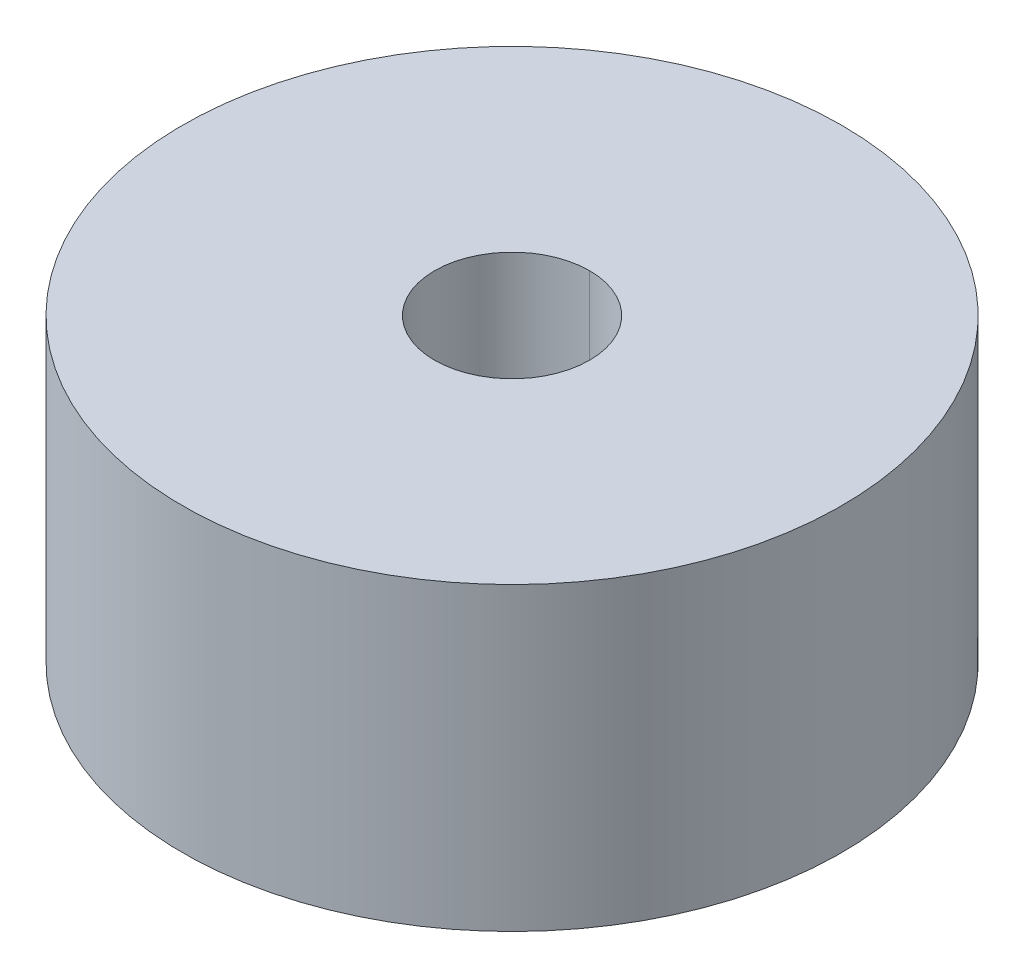
ISO-10303-21;
HEADER;
FILE_DESCRIPTION(('STEP AP214'),'2;1');
FILE_NAME('part.step','',(''),(''),'','','');
FILE_SCHEMA(('AUTOMOTIVE_DESIGN { 1 0 10303 214 1 1 1 1 }'));
ENDSEC;
DATA;
#1=APPLICATION_CONTEXT('core data for automotive mechanical design processes');
#2=APPLICATION_PROTOCOL_DEFINITION('international standard','automotive_design',2000,#1);
#3=PRODUCT_CONTEXT('',#1,'mechanical');
#4=PRODUCT('Part','Part','',(#3));
#5=PRODUCT_RELATED_PRODUCT_CATEGORY('part','',(#4));
#6=PRODUCT_DEFINITION_FORMATION('','',#4);
#7=PRODUCT_DEFINITION_CONTEXT('part definition',#1,'design');
#8=PRODUCT_DEFINITION('design','',#6,#7);
#9=PRODUCT_DEFINITION_SHAPE('','',#8);
#10=(LENGTH_UNIT() NAMED_UNIT(*) SI_UNIT(.MILLI.,.METRE.));
#11=(NAMED_UNIT(*) PLANE_ANGLE_UNIT() SI_UNIT($,.RADIAN.));
#12=(NAMED_UNIT(*) SI_UNIT($,.STERADIAN.) SOLID_ANGLE_UNIT());
#13=UNCERTAINTY_MEASURE_WITH_UNIT(LENGTH_MEASURE(1.E-05),#10,'distance_accuracy_value','');
#14=(GEOMETRIC_REPRESENTATION_CONTEXT(3) GLOBAL_UNCERTAINTY_ASSIGNED_CONTEXT((#13)) GLOBAL_UNIT_ASSIGNED_CONTEXT((#10,
#11,#12)) REPRESENTATION_CONTEXT('',''));
#15=CARTESIAN_POINT('',(0.,0.,0.));
#16=DIRECTION('',(0.,0.,1.));
#17=DIRECTION('',(1.,0.,0.));
#18=AXIS2_PLACEMENT_3D('',#15,#16,#17);
#19=CARTESIAN_POINT('',(0.,0.,14.));
#20=DIRECTION('',(0.,-1.,0.));
#21=DIRECTION('',(0.,0.,-1.));
#22=AXIS2_PLACEMENT_3D('',#19,#20,#21);
#23=CYLINDRICAL_SURFACE('',#22,2.1);
#24=DIRECTION('',(0.,-1.,0.));
#25=VECTOR('',#24,1.);
#26=CARTESIAN_POINT('',(0.,0.,16.1));
#27=LINE('',#26,#25);
#28=CARTESIAN_POINT('',(0.,5.,16.1));
#29=VERTEX_POINT('',#28);
#30=CARTESIAN_POINT('',(0.,0.,16.1));
#31=VERTEX_POINT('',#30);
#32=EDGE_CURVE('E249',#29,#31,#27,.T.);
#33=ORIENTED_EDGE('',*,*,#32,.F.);
#34=CARTESIAN_POINT('',(0.,5.,14.));
#35=DIRECTION('',(0.,-1.,0.));
#36=DIRECTION('',(0.,0.,-1.));
#37=AXIS2_PLACEMENT_3D('',#34,#35,#36);
#38=CIRCLE('',#37,2.1);
#39=CARTESIAN_POINT('',(0.,5.,11.9));
#40=VERTEX_POINT('',#39);
#41=EDGE_CURVE('E11',#40,#29,#38,.T.);
#42=ORIENTED_EDGE('',*,*,#41,.F.);
#43=DIRECTION('',(0.,-1.,0.));
#44=VECTOR('',#43,1.);
#45=CARTESIAN_POINT('',(0.,0.,11.9));
#46=LINE('',#45,#44);
#47=CARTESIAN_POINT('',(0.,0.,11.9));
#48=VERTEX_POINT('',#47);
#49=EDGE_CURVE('E333',#40,#48,#46,.T.);
#50=ORIENTED_EDGE('',*,*,#49,.T.);
#51=CARTESIAN_POINT('',(0.,0.,14.));
#52=DIRECTION('',(0.,-1.,0.));
#53=DIRECTION('',(0.,0.,-1.));
#54=AXIS2_PLACEMENT_3D('',#51,#52,#53);
#55=CIRCLE('',#54,2.1);
#56=EDGE_CURVE('E325',#48,#31,#55,.T.);
#57=ORIENTED_EDGE('',*,*,#56,.T.);
#58=EDGE_LOOP('',(#33,#42,#50,#57));
#59=FACE_BOUND('',#58,.T.);
#60=ADVANCED_FACE('F48',(#59),#23,.F.);
#61=CARTESIAN_POINT('',(0.,5.,14.));
#62=DIRECTION('',(0.,-1.,0.));
#63=DIRECTION('',(0.,0.,-1.));
#64=AXIS2_PLACEMENT_3D('',#61,#62,#63);
#65=CONICAL_SURFACE('',#64,2.1,1.02974425867665);
#66=DIRECTION('',(0.,-0.515038074910055,0.857167300702112));
#67=VECTOR('',#66,1.);
#68=CARTESIAN_POINT('',(0.,5.,16.1));
#69=LINE('',#68,#67);
#70=CARTESIAN_POINT('',(0.,6.26180729995788,14.));
#71=VERTEX_POINT('',#70);
#72=EDGE_CURVE('E282',#71,#29,#69,.T.);
#73=ORIENTED_EDGE('',*,*,#72,.F.);
#74=DIRECTION('',(0.,-0.515038074910055,-0.857167300702112));
#75=VECTOR('',#74,1.);
#76=CARTESIAN_POINT('',(0.,5.,11.9));
#77=LINE('',#76,#75);
#78=EDGE_CURVE('E287',#71,#40,#77,.T.);
#79=ORIENTED_EDGE('',*,*,#78,.T.);
#80=ORIENTED_EDGE('',*,*,#41,.T.);
#81=EDGE_LOOP('',(#73,#79,#80));
#82=FACE_BOUND('',#81,.T.);
#83=ADVANCED_FACE('F471',(#82),#65,.F.);
#84=CARTESIAN_POINT('',(-12.1243556529818,0.,6.99999999999948));
#85=DIRECTION('',(0.,-1.,0.));
#86=DIRECTION('',(0.,0.,-1.));
#87=AXIS2_PLACEMENT_3D('',#84,#85,#86);
#88=CYLINDRICAL_SURFACE('',#87,2.1);
#89=DIRECTION('',(0.,-1.,0.));
#90=VECTOR('',#89,1.);
#91=CARTESIAN_POINT('',(-12.1243556529818,0.,9.09999999999947));
#92=LINE('',#91,#90);
#93=CARTESIAN_POINT('',(-12.1243556529818,5.,9.09999999999948));
#94=VERTEX_POINT('',#93);
#95=CARTESIAN_POINT('',(-12.1243556529818,0.,9.09999999999947));
#96=VERTEX_POINT('',#95);
#97=EDGE_CURVE('E298',#94,#96,#92,.T.);
#98=ORIENTED_EDGE('',*,*,#97,.F.);
#99=CARTESIAN_POINT('',(-12.1243556529818,5.,6.99999999999948));
#100=DIRECTION('',(0.,-1.,0.));
#101=DIRECTION('',(0.,0.,-1.));
#102=AXIS2_PLACEMENT_3D('',#99,#100,#101);
#103=CIRCLE('',#102,2.1);
#104=CARTESIAN_POINT('',(-12.1243556529818,5.,4.89999999999948));
#105=VERTEX_POINT('',#104);
#106=EDGE_CURVE('E58',#105,#94,#103,.T.);
#107=ORIENTED_EDGE('',*,*,#106,.F.);
#108=DIRECTION('',(0.,-1.,0.));
#109=VECTOR('',#108,1.);
#110=CARTESIAN_POINT('',(-12.1243556529818,0.,4.89999999999948));
#111=LINE('',#110,#109);
#112=CARTESIAN_POINT('',(-12.1243556529818,0.,4.89999999999949));
#113=VERTEX_POINT('',#112);
#114=EDGE_CURVE('E337',#105,#113,#111,.T.);
#115=ORIENTED_EDGE('',*,*,#114,.T.);
#116=CARTESIAN_POINT('',(-12.1243556529818,0.,6.99999999999948));
#117=DIRECTION('',(0.,-1.,0.));
#118=DIRECTION('',(0.,0.,-1.));
#119=AXIS2_PLACEMENT_3D('',#116,#117,#118);
#120=CIRCLE('',#119,2.1);
#121=EDGE_CURVE('E343',#113,#96,#120,.T.);
#122=ORIENTED_EDGE('',*,*,#121,.T.);
#123=EDGE_LOOP('',(#98,#107,#115,#122));
#124=FACE_BOUND('',#123,.T.);
#125=ADVANCED_FACE('F476',(#124),#88,.F.);
#126=CARTESIAN_POINT('',(-12.1243556529818,5.,6.99999999999948));
#127=DIRECTION('',(0.,-1.,0.));
#128=DIRECTION('',(0.,0.,-1.));
#129=AXIS2_PLACEMENT_3D('',#126,#127,#128);
#130=CONICAL_SURFACE('',#129,2.1,1.02974425867665);
#131=DIRECTION('',(0.,-0.515038074910055,0.857167300702112));
#132=VECTOR('',#131,1.);
#133=CARTESIAN_POINT('',(-12.1243556529818,5.,9.09999999999948));
#134=LINE('',#133,#132);
#135=CARTESIAN_POINT('',(-12.1243556529818,6.26180729995788,6.99999999999948));
#136=VERTEX_POINT('',#135);
#137=EDGE_CURVE('E255',#136,#94,#134,.T.);
#138=ORIENTED_EDGE('',*,*,#137,.F.);
#139=DIRECTION('',(0.,-0.515038074910055,-0.857167300702112));
#140=VECTOR('',#139,1.);
#141=CARTESIAN_POINT('',(-12.1243556529818,5.,4.89999999999948));
#142=LINE('',#141,#140);
#143=EDGE_CURVE('E260',#136,#105,#142,.T.);
#144=ORIENTED_EDGE('',*,*,#143,.T.);
#145=ORIENTED_EDGE('',*,*,#106,.T.);
#146=EDGE_LOOP('',(#138,#144,#145));
#147=FACE_BOUND('',#146,.T.);
#148=ADVANCED_FACE('F512',(#147),#130,.F.);
#149=CARTESIAN_POINT('',(-12.1243556529812,0.,-7.00000000000052));
#150=DIRECTION('',(0.,-1.,0.));
#151=DIRECTION('',(0.,0.,-1.));
#152=AXIS2_PLACEMENT_3D('',#149,#150,#151);
#153=CYLINDRICAL_SURFACE('',#152,2.1);
#154=DIRECTION('',(0.,-1.,0.));
#155=VECTOR('',#154,1.);
#156=CARTESIAN_POINT('',(-12.1243556529812,0.,-4.90000000000053));
#157=LINE('',#156,#155);
#158=CARTESIAN_POINT('',(-12.1243556529812,5.,-4.90000000000052));
#159=VERTEX_POINT('',#158);
#160=CARTESIAN_POINT('',(-12.1243556529812,0.,-4.90000000000053));
#161=VERTEX_POINT('',#160);
#162=EDGE_CURVE('E232',#159,#161,#157,.T.);
#163=ORIENTED_EDGE('',*,*,#162,.F.);
#164=CARTESIAN_POINT('',(-12.1243556529812,5.,-7.00000000000052));
#165=DIRECTION('',(0.,-1.,0.));
#166=DIRECTION('',(0.,0.,-1.));
#167=AXIS2_PLACEMENT_3D('',#164,#165,#166);
#168=CIRCLE('',#167,2.1);
#169=CARTESIAN_POINT('',(-12.1243556529812,5.,-9.10000000000052));
#170=VERTEX_POINT('',#169);
#171=EDGE_CURVE('E394',#170,#159,#168,.T.);
#172=ORIENTED_EDGE('',*,*,#171,.F.);
#173=DIRECTION('',(0.,-1.,0.));
#174=VECTOR('',#173,1.);
#175=CARTESIAN_POINT('',(-12.1243556529812,0.,-9.10000000000052));
#176=LINE('',#175,#174);
#177=CARTESIAN_POINT('',(-12.1243556529812,0.,-9.10000000000051));
#178=VERTEX_POINT('',#177);
#179=EDGE_CURVE('E231',#170,#178,#176,.T.);
#180=ORIENTED_EDGE('',*,*,#179,.T.);
#181=CARTESIAN_POINT('',(-12.1243556529812,0.,-7.00000000000052));
#182=DIRECTION('',(0.,-1.,0.));
#183=DIRECTION('',(0.,0.,-1.));
#184=AXIS2_PLACEMENT_3D('',#181,#182,#183);
#185=CIRCLE('',#184,2.1);
#186=EDGE_CURVE('E347',#178,#161,#185,.T.);
#187=ORIENTED_EDGE('',*,*,#186,.T.);
#188=EDGE_LOOP('',(#163,#172,#180,#187));
#189=FACE_BOUND('',#188,.T.);
#190=ADVANCED_FACE('F509',(#189),#153,.F.);
#191=CARTESIAN_POINT('',(-12.1243556529812,5.,-7.00000000000052));
#192=DIRECTION('',(0.,-1.,0.));
#193=DIRECTION('',(0.,0.,-1.));
#194=AXIS2_PLACEMENT_3D('',#191,#192,#193);
#195=CONICAL_SURFACE('',#194,2.1,1.02974425867665);
#196=DIRECTION('',(0.,-0.515038074910055,0.857167300702112));
#197=VECTOR('',#196,1.);
#198=CARTESIAN_POINT('',(-12.1243556529812,5.,-4.90000000000052));
#199=LINE('',#198,#197);
#200=CARTESIAN_POINT('',(-12.1243556529812,6.26180729995788,-7.00000000000052));
#201=VERTEX_POINT('',#200);
#202=EDGE_CURVE('E275',#201,#159,#199,.T.);
#203=ORIENTED_EDGE('',*,*,#202,.F.);
#204=DIRECTION('',(0.,-0.515038074910055,-0.857167300702112));
#205=VECTOR('',#204,1.);
#206=CARTESIAN_POINT('',(-12.1243556529812,5.,-9.10000000000052));
#207=LINE('',#206,#205);
#208=EDGE_CURVE('E291',#201,#170,#207,.T.);
#209=ORIENTED_EDGE('',*,*,#208,.T.);
#210=ORIENTED_EDGE('',*,*,#171,.T.);
#211=EDGE_LOOP('',(#203,#209,#210));
#212=FACE_BOUND('',#211,.T.);
#213=ADVANCED_FACE('F511',(#212),#195,.F.);
#214=CARTESIAN_POINT('',(1.18856827952055E-12,0.,-14.));
#215=DIRECTION('',(0.,-1.,0.));
#216=DIRECTION('',(0.,0.,-1.));
#217=AXIS2_PLACEMENT_3D('',#214,#215,#216);
#218=CYLINDRICAL_SURFACE('',#217,2.1);
#219=DIRECTION('',(0.,-1.,0.));
#220=VECTOR('',#219,1.);
#221=CARTESIAN_POINT('',(1.18882545534837E-12,0.,-11.9));
#222=LINE('',#221,#220);
#223=CARTESIAN_POINT('',(1.18882545534837E-12,5.,-11.9));
#224=VERTEX_POINT('',#223);
#225=CARTESIAN_POINT('',(1.18882545534837E-12,0.,-11.9));
#226=VERTEX_POINT('',#225);
#227=EDGE_CURVE('E274',#224,#226,#222,.T.);
#228=ORIENTED_EDGE('',*,*,#227,.F.);
#229=CARTESIAN_POINT('',(1.18856827952055E-12,5.,-14.));
#230=DIRECTION('',(0.,-1.,0.));
#231=DIRECTION('',(0.,0.,-1.));
#232=AXIS2_PLACEMENT_3D('',#229,#230,#231);
#233=CIRCLE('',#232,2.1);
#234=CARTESIAN_POINT('',(1.18856827952055E-12,5.,-16.1));
#235=VERTEX_POINT('',#234);
#236=EDGE_CURVE('E397',#235,#224,#233,.T.);
#237=ORIENTED_EDGE('',*,*,#236,.F.);
#238=DIRECTION('',(0.,-1.,0.));
#239=VECTOR('',#238,1.);
#240=CARTESIAN_POINT('',(1.18856827952055E-12,0.,-16.1));
#241=LINE('',#240,#239);
#242=CARTESIAN_POINT('',(1.18856827952055E-12,0.,-16.1));
#243=VERTEX_POINT('',#242);
#244=EDGE_CURVE('E359',#235,#243,#241,.T.);
#245=ORIENTED_EDGE('',*,*,#244,.T.);
#246=CARTESIAN_POINT('',(1.18856827952055E-12,0.,-14.));
#247=DIRECTION('',(0.,-1.,0.));
#248=DIRECTION('',(0.,0.,-1.));
#249=AXIS2_PLACEMENT_3D('',#246,#247,#248);
#250=CIRCLE('',#249,2.1);
#251=EDGE_CURVE('E377',#243,#226,#250,.T.);
#252=ORIENTED_EDGE('',*,*,#251,.T.);
#253=EDGE_LOOP('',(#228,#237,#245,#252));
#254=FACE_BOUND('',#253,.T.);
#255=ADVANCED_FACE('F518',(#254),#218,.F.);
#256=CARTESIAN_POINT('',(1.18856827952055E-12,5.,-14.));
#257=DIRECTION('',(0.,-1.,0.));
#258=DIRECTION('',(0.,0.,-1.));
#259=AXIS2_PLACEMENT_3D('',#256,#257,#258);
#260=CONICAL_SURFACE('',#259,2.1,1.02974425867665);
#261=DIRECTION('',(0.,-0.515038074910055,0.857167300702112));
#262=VECTOR('',#261,1.);
#263=CARTESIAN_POINT('',(1.18882545534837E-12,5.,-11.9));
#264=LINE('',#263,#262);
#265=CARTESIAN_POINT('',(1.18703457906719E-12,6.26180729995788,-14.));
#266=VERTEX_POINT('',#265);
#267=EDGE_CURVE('E233',#266,#224,#264,.T.);
#268=ORIENTED_EDGE('',*,*,#267,.F.);
#269=DIRECTION('',(0.,-0.515038074910055,-0.857167300702112));
#270=VECTOR('',#269,1.);
#271=CARTESIAN_POINT('',(1.18856827952055E-12,5.,-16.1));
#272=LINE('',#271,#270);
#273=EDGE_CURVE('E238',#266,#235,#272,.T.);
#274=ORIENTED_EDGE('',*,*,#273,.T.);
#275=ORIENTED_EDGE('',*,*,#236,.T.);
#276=EDGE_LOOP('',(#268,#274,#275));
#277=FACE_BOUND('',#276,.T.);
#278=ADVANCED_FACE('F571',(#277),#260,.F.);
#279=CARTESIAN_POINT('',(12.124355652983,0.,-6.99999999999948));
#280=DIRECTION('',(0.,-1.,0.));
#281=DIRECTION('',(0.,0.,-1.));
#282=AXIS2_PLACEMENT_3D('',#279,#280,#281);
#283=CYLINDRICAL_SURFACE('',#282,2.1);
#284=DIRECTION('',(0.,-1.,0.));
#285=VECTOR('',#284,1.);
#286=CARTESIAN_POINT('',(12.124355652983,0.,-4.89999999999949));
#287=LINE('',#286,#285);
#288=CARTESIAN_POINT('',(12.124355652983,5.,-4.89999999999948));
#289=VERTEX_POINT('',#288);
#290=CARTESIAN_POINT('',(12.124355652983,0.,-4.89999999999949));
#291=VERTEX_POINT('',#290);
#292=EDGE_CURVE('E264',#289,#291,#287,.T.);
#293=ORIENTED_EDGE('',*,*,#292,.F.);
#294=CARTESIAN_POINT('',(12.124355652983,5.,-6.99999999999948));
#295=DIRECTION('',(0.,-1.,0.));
#296=DIRECTION('',(0.,0.,-1.));
#297=AXIS2_PLACEMENT_3D('',#294,#295,#296);
#298=CIRCLE('',#297,2.1);
#299=CARTESIAN_POINT('',(12.124355652983,5.,-9.09999999999948));
#300=VERTEX_POINT('',#299);
#301=EDGE_CURVE('E329',#300,#289,#298,.T.);
#302=ORIENTED_EDGE('',*,*,#301,.F.);
#303=DIRECTION('',(0.,-1.,0.));
#304=VECTOR('',#303,1.);
#305=CARTESIAN_POINT('',(12.124355652983,0.,-9.09999999999948));
#306=LINE('',#305,#304);
#307=CARTESIAN_POINT('',(12.124355652983,0.,-9.09999999999947));
#308=VERTEX_POINT('',#307);
#309=EDGE_CURVE('E239',#300,#308,#306,.T.);
#310=ORIENTED_EDGE('',*,*,#309,.T.);
#311=CARTESIAN_POINT('',(12.124355652983,0.,-6.99999999999948));
#312=DIRECTION('',(0.,-1.,0.));
#313=DIRECTION('',(0.,0.,-1.));
#314=AXIS2_PLACEMENT_3D('',#311,#312,#313);
#315=CIRCLE('',#314,2.1);
#316=EDGE_CURVE('E368',#308,#291,#315,.T.);
#317=ORIENTED_EDGE('',*,*,#316,.T.);
#318=EDGE_LOOP('',(#293,#302,#310,#317));
#319=FACE_BOUND('',#318,.T.);
#320=ADVANCED_FACE('F507',(#319),#283,.F.);
#321=CARTESIAN_POINT('',(12.124355652983,5.,-6.99999999999948));
#322=DIRECTION('',(0.,-1.,0.));
#323=DIRECTION('',(0.,0.,-1.));
#324=AXIS2_PLACEMENT_3D('',#321,#322,#323);
#325=CONICAL_SURFACE('',#324,2.1,1.02974425867665);
#326=DIRECTION('',(0.,-0.515038074910055,0.857167300702112));
#327=VECTOR('',#326,1.);
#328=CARTESIAN_POINT('',(12.124355652983,5.,-4.89999999999948));
#329=LINE('',#328,#327);
#330=CARTESIAN_POINT('',(12.124355652983,6.26180729995788,-6.99999999999948));
#331=VERTEX_POINT('',#330);
#332=EDGE_CURVE('E248',#331,#289,#329,.T.);
#333=ORIENTED_EDGE('',*,*,#332,.F.);
#334=DIRECTION('',(0.,-0.515038074910055,-0.857167300702112));
#335=VECTOR('',#334,1.);
#336=CARTESIAN_POINT('',(12.124355652983,5.,-9.09999999999948));
#337=LINE('',#336,#335);
#338=EDGE_CURVE('E243',#331,#300,#337,.T.);
#339=ORIENTED_EDGE('',*,*,#338,.T.);
#340=ORIENTED_EDGE('',*,*,#301,.T.);
#341=EDGE_LOOP('',(#333,#339,#340));
#342=FACE_BOUND('',#341,.T.);
#343=ADVANCED_FACE('F504',(#342),#325,.F.);
#344=CARTESIAN_POINT('',(12.1243556529824,0.,7.00000000000052));
#345=DIRECTION('',(0.,-1.,0.));
#346=DIRECTION('',(0.,0.,-1.));
#347=AXIS2_PLACEMENT_3D('',#344,#345,#346);
#348=CYLINDRICAL_SURFACE('',#347,2.1);
#349=DIRECTION('',(0.,-1.,0.));
#350=VECTOR('',#349,1.);
#351=CARTESIAN_POINT('',(12.1243556529824,0.,9.10000000000051));
#352=LINE('',#351,#350);
#353=CARTESIAN_POINT('',(12.1243556529824,5.,9.10000000000052));
#354=VERTEX_POINT('',#353);
#355=CARTESIAN_POINT('',(12.1243556529824,0.,9.10000000000051));
#356=VERTEX_POINT('',#355);
#357=EDGE_CURVE('E292',#354,#356,#352,.T.);
#358=ORIENTED_EDGE('',*,*,#357,.F.);
#359=CARTESIAN_POINT('',(12.1243556529824,5.,7.00000000000052));
#360=DIRECTION('',(0.,-1.,0.));
#361=DIRECTION('',(0.,0.,-1.));
#362=AXIS2_PLACEMENT_3D('',#359,#360,#361);
#363=CIRCLE('',#362,2.1);
#364=CARTESIAN_POINT('',(12.1243556529824,5.,4.90000000000052));
#365=VERTEX_POINT('',#364);
#366=EDGE_CURVE('E326',#365,#354,#363,.T.);
#367=ORIENTED_EDGE('',*,*,#366,.F.);
#368=DIRECTION('',(0.,-1.,0.));
#369=VECTOR('',#368,1.);
#370=CARTESIAN_POINT('',(12.1243556529824,0.,4.90000000000052));
#371=LINE('',#370,#369);
#372=CARTESIAN_POINT('',(12.1243556529824,0.,4.90000000000053));
#373=VERTEX_POINT('',#372);
#374=EDGE_CURVE('E338',#365,#373,#371,.T.);
#375=ORIENTED_EDGE('',*,*,#374,.T.);
#376=CARTESIAN_POINT('',(12.1243556529824,0.,7.00000000000052));
#377=DIRECTION('',(0.,-1.,0.));
#378=DIRECTION('',(0.,0.,-1.));
#379=AXIS2_PLACEMENT_3D('',#376,#377,#378);
#380=CIRCLE('',#379,2.1);
#381=EDGE_CURVE('E319',#373,#356,#380,.T.);
#382=ORIENTED_EDGE('',*,*,#381,.T.);
#383=EDGE_LOOP('',(#358,#367,#375,#382));
#384=FACE_BOUND('',#383,.T.);
#385=ADVANCED_FACE('F506',(#384),#348,.F.);
#386=CARTESIAN_POINT('',(12.1243556529824,5.,7.00000000000052));
#387=DIRECTION('',(0.,-1.,0.));
#388=DIRECTION('',(0.,0.,-1.));
#389=AXIS2_PLACEMENT_3D('',#386,#387,#388);
#390=CONICAL_SURFACE('',#389,2.1,1.02974425867665);
#391=DIRECTION('',(0.,-0.515038074910055,0.857167300702112));
#392=VECTOR('',#391,1.);
#393=CARTESIAN_POINT('',(12.1243556529824,5.,9.10000000000052));
#394=LINE('',#393,#392);
#395=CARTESIAN_POINT('',(12.1243556529824,6.26180729995788,7.00000000000052));
#396=VERTEX_POINT('',#395);
#397=EDGE_CURVE('E225',#396,#354,#394,.T.);
#398=ORIENTED_EDGE('',*,*,#397,.F.);
#399=DIRECTION('',(0.,-0.515038074910055,-0.857167300702112));
#400=VECTOR('',#399,1.);
#401=CARTESIAN_POINT('',(12.1243556529824,5.,4.90000000000052));
#402=LINE('',#401,#400);
#403=EDGE_CURVE('E342',#396,#365,#402,.T.);
#404=ORIENTED_EDGE('',*,*,#403,.T.);
#405=ORIENTED_EDGE('',*,*,#366,.T.);
#406=EDGE_LOOP('',(#398,#404,#405));
#407=FACE_BOUND('',#406,.T.);
#408=ADVANCED_FACE('F554',(#407),#390,.F.);
#409=CARTESIAN_POINT('',(17.5,1.,0.));
#410=DIRECTION('',(0.,-1.,0.));
#411=DIRECTION('',(0.,0.,-1.));
#412=AXIS2_PLACEMENT_3D('',#409,#410,#411);
#413=PLANE('',#412);
#414=CARTESIAN_POINT('',(0.,1.,0.));
#415=DIRECTION('',(0.,-1.,0.));
#416=DIRECTION('',(0.,0.,-1.));
#417=AXIS2_PLACEMENT_3D('',#414,#415,#416);
#418=CIRCLE('',#417,17.5);
#419=CARTESIAN_POINT('',(0.,1.,-17.5));
#420=VERTEX_POINT('',#419);
#421=CARTESIAN_POINT('',(0.,1.,17.5));
#422=VERTEX_POINT('',#421);
#423=EDGE_CURVE('E416',#420,#422,#418,.T.);
#424=ORIENTED_EDGE('',*,*,#423,.F.);
#425=CARTESIAN_POINT('',(0.,1.,0.));
#426=DIRECTION('',(0.,-1.,0.));
#427=DIRECTION('',(0.,0.,-1.));
#428=AXIS2_PLACEMENT_3D('',#425,#426,#427);
#429=CIRCLE('',#428,17.5);
#430=EDGE_CURVE('E310',#422,#420,#429,.T.);
#431=ORIENTED_EDGE('',*,*,#430,.F.);
#432=EDGE_LOOP('',(#424,#431));
#433=FACE_BOUND('',#432,.T.);
#434=CARTESIAN_POINT('',(0.,1.,0.));
#435=DIRECTION('',(0.,-1.,0.));
#436=DIRECTION('',(0.,0.,-1.));
#437=AXIS2_PLACEMENT_3D('',#434,#435,#436);
#438=CIRCLE('',#437,34.);
#439=CARTESIAN_POINT('',(0.,1.,-34.));
#440=VERTEX_POINT('',#439);
#441=EDGE_CURVE('E215',#440,#440,#438,.T.);
#442=ORIENTED_EDGE('',*,*,#441,.T.);
#443=EDGE_LOOP('',(#442));
#444=FACE_BOUND('',#443,.T.);
#445=ADVANCED_FACE('F219',(#433,#444),#413,.T.);
#446=CARTESIAN_POINT('',(34.,32.,0.));
#447=DIRECTION('',(0.,1.,0.));
#448=DIRECTION('',(1.,0.,0.));
#449=AXIS2_PLACEMENT_3D('',#446,#447,#448);
#450=PLANE('',#449);
#451=CARTESIAN_POINT('',(0.,32.,0.));
#452=DIRECTION('',(0.,-1.,0.));
#453=DIRECTION('',(0.,0.,-1.));
#454=AXIS2_PLACEMENT_3D('',#451,#452,#453);
#455=CIRCLE('',#454,8.);
#456=CARTESIAN_POINT('',(0.,32.,-8.));
#457=VERTEX_POINT('',#456);
#458=CARTESIAN_POINT('',(0.,32.,8.));
#459=VERTEX_POINT('',#458);
#460=EDGE_CURVE('E318',#457,#459,#455,.T.);
#461=ORIENTED_EDGE('',*,*,#460,.T.);
#462=CARTESIAN_POINT('',(0.,32.,0.));
#463=DIRECTION('',(0.,-1.,0.));
#464=DIRECTION('',(0.,0.,-1.));
#465=AXIS2_PLACEMENT_3D('',#462,#463,#464);
#466=CIRCLE('',#465,8.);
#467=EDGE_CURVE('E217',#459,#457,#466,.T.);
#468=ORIENTED_EDGE('',*,*,#467,.T.);
#469=EDGE_LOOP('',(#461,#468));
#470=FACE_BOUND('',#469,.T.);
#471=CARTESIAN_POINT('',(0.,32.,0.));
#472=DIRECTION('',(0.,-1.,0.));
#473=DIRECTION('',(0.,0.,-1.));
#474=AXIS2_PLACEMENT_3D('',#471,#472,#473);
#475=CIRCLE('',#474,34.);
#476=CARTESIAN_POINT('',(0.,32.,-34.));
#477=VERTEX_POINT('',#476);
#478=EDGE_CURVE('E206',#477,#477,#475,.T.);
#479=ORIENTED_EDGE('',*,*,#478,.F.);
#480=EDGE_LOOP('',(#479));
#481=FACE_BOUND('',#480,.T.);
#482=ADVANCED_FACE('F464',(#470,#481),#450,.T.);
#483=CARTESIAN_POINT('',(0.,0.,0.));
#484=DIRECTION('',(0.,-1.,0.));
#485=DIRECTION('',(0.,0.,-1.));
#486=AXIS2_PLACEMENT_3D('',#483,#484,#485);
#487=CYLINDRICAL_SURFACE('',#486,8.);
#488=DIRECTION('',(0.,-1.,0.));
#489=VECTOR('',#488,1.);
#490=CARTESIAN_POINT('',(0.,0.,8.));
#491=LINE('',#490,#489);
#492=CARTESIAN_POINT('',(0.,0.,8.));
#493=VERTEX_POINT('',#492);
#494=EDGE_CURVE('E265',#459,#493,#491,.T.);
#495=ORIENTED_EDGE('',*,*,#494,.F.);
#496=ORIENTED_EDGE('',*,*,#460,.F.);
#497=DIRECTION('',(0.,-1.,0.));
#498=VECTOR('',#497,1.);
#499=CARTESIAN_POINT('',(0.,0.,-8.));
#500=LINE('',#499,#498);
#501=CARTESIAN_POINT('',(0.,0.,-8.));
#502=VERTEX_POINT('',#501);
#503=EDGE_CURVE('E393',#457,#502,#500,.T.);
#504=ORIENTED_EDGE('',*,*,#503,.T.);
#505=CARTESIAN_POINT('',(0.,0.,0.));
#506=DIRECTION('',(0.,-1.,0.));
#507=DIRECTION('',(0.,0.,-1.));
#508=AXIS2_PLACEMENT_3D('',#505,#506,#507);
#509=CIRCLE('',#508,8.);
#510=EDGE_CURVE('E315',#502,#493,#509,.T.);
#511=ORIENTED_EDGE('',*,*,#510,.T.);
#512=EDGE_LOOP('',(#495,#496,#504,#511));
#513=FACE_BOUND('',#512,.T.);
#514=ADVANCED_FACE('F456',(#513),#487,.F.);
#515=CARTESIAN_POINT('',(8.,0.,0.));
#516=DIRECTION('',(0.,-1.,0.));
#517=DIRECTION('',(0.,0.,-1.));
#518=AXIS2_PLACEMENT_3D('',#515,#516,#517);
#519=PLANE('',#518);
#520=ORIENTED_EDGE('',*,*,#510,.F.);
#521=CARTESIAN_POINT('',(0.,0.,0.));
#522=DIRECTION('',(0.,-1.,0.));
#523=DIRECTION('',(0.,0.,-1.));
#524=AXIS2_PLACEMENT_3D('',#521,#522,#523);
#525=CIRCLE('',#524,8.);
#526=EDGE_CURVE('E269',#493,#502,#525,.T.);
#527=ORIENTED_EDGE('',*,*,#526,.F.);
#528=EDGE_LOOP('',(#520,#527));
#529=FACE_BOUND('',#528,.T.);
#530=ORIENTED_EDGE('',*,*,#381,.F.);
#531=CARTESIAN_POINT('',(12.1243556529824,0.,7.00000000000052));
#532=DIRECTION('',(0.,-1.,0.));
#533=DIRECTION('',(0.,0.,-1.));
#534=AXIS2_PLACEMENT_3D('',#531,#532,#533);
#535=CIRCLE('',#534,2.1);
#536=EDGE_CURVE('E296',#356,#373,#535,.T.);
#537=ORIENTED_EDGE('',*,*,#536,.F.);
#538=EDGE_LOOP('',(#530,#537));
#539=FACE_BOUND('',#538,.T.);
#540=ORIENTED_EDGE('',*,*,#316,.F.);
#541=CARTESIAN_POINT('',(12.124355652983,0.,-6.99999999999948));
#542=DIRECTION('',(0.,-1.,0.));
#543=DIRECTION('',(0.,0.,-1.));
#544=AXIS2_PLACEMENT_3D('',#541,#542,#543);
#545=CIRCLE('',#544,2.1);
#546=EDGE_CURVE('E244',#291,#308,#545,.T.);
#547=ORIENTED_EDGE('',*,*,#546,.F.);
#548=EDGE_LOOP('',(#540,#547));
#549=FACE_BOUND('',#548,.T.);
#550=ORIENTED_EDGE('',*,*,#251,.F.);
#551=CARTESIAN_POINT('',(1.18856827952055E-12,0.,-14.));
#552=DIRECTION('',(0.,-1.,0.));
#553=DIRECTION('',(0.,0.,-1.));
#554=AXIS2_PLACEMENT_3D('',#551,#552,#553);
#555=CIRCLE('',#554,2.1);
#556=EDGE_CURVE('E306',#226,#243,#555,.T.);
#557=ORIENTED_EDGE('',*,*,#556,.F.);
#558=EDGE_LOOP('',(#550,#557));
#559=FACE_BOUND('',#558,.T.);
#560=ORIENTED_EDGE('',*,*,#186,.F.);
#561=CARTESIAN_POINT('',(-12.1243556529812,0.,-7.00000000000052));
#562=DIRECTION('',(0.,-1.,0.));
#563=DIRECTION('',(0.,0.,-1.));
#564=AXIS2_PLACEMENT_3D('',#561,#562,#563);
#565=CIRCLE('',#564,2.1);
#566=EDGE_CURVE('E228',#161,#178,#565,.T.);
#567=ORIENTED_EDGE('',*,*,#566,.F.);
#568=EDGE_LOOP('',(#560,#567));
#569=FACE_BOUND('',#568,.T.);
#570=ORIENTED_EDGE('',*,*,#121,.F.);
#571=CARTESIAN_POINT('',(-12.1243556529818,0.,6.99999999999948));
#572=DIRECTION('',(0.,-1.,0.));
#573=DIRECTION('',(0.,0.,-1.));
#574=AXIS2_PLACEMENT_3D('',#571,#572,#573);
#575=CIRCLE('',#574,2.1);
#576=EDGE_CURVE('E302',#96,#113,#575,.T.);
#577=ORIENTED_EDGE('',*,*,#576,.F.);
#578=EDGE_LOOP('',(#570,#577));
#579=FACE_BOUND('',#578,.T.);
#580=ORIENTED_EDGE('',*,*,#56,.F.);
#581=CARTESIAN_POINT('',(0.,0.,14.));
#582=DIRECTION('',(0.,-1.,0.));
#583=DIRECTION('',(0.,0.,-1.));
#584=AXIS2_PLACEMENT_3D('',#581,#582,#583);
#585=CIRCLE('',#584,2.1);
#586=EDGE_CURVE('E253',#31,#48,#585,.T.);
#587=ORIENTED_EDGE('',*,*,#586,.F.);
#588=EDGE_LOOP('',(#580,#587));
#589=FACE_BOUND('',#588,.T.);
#590=CARTESIAN_POINT('',(0.,0.,0.));
#591=DIRECTION('',(0.,-1.,0.));
#592=DIRECTION('',(0.,0.,-1.));
#593=AXIS2_PLACEMENT_3D('',#590,#591,#592);
#594=CIRCLE('',#593,17.5);
#595=CARTESIAN_POINT('',(0.,0.,-17.5));
#596=VERTEX_POINT('',#595);
#597=CARTESIAN_POINT('',(0.,0.,17.5));
#598=VERTEX_POINT('',#597);
#599=EDGE_CURVE('E311',#596,#598,#594,.T.);
#600=ORIENTED_EDGE('',*,*,#599,.T.);
#601=CARTESIAN_POINT('',(0.,0.,0.));
#602=DIRECTION('',(0.,-1.,0.));
#603=DIRECTION('',(0.,0.,-1.));
#604=AXIS2_PLACEMENT_3D('',#601,#602,#603);
#605=CIRCLE('',#604,17.5);
#606=EDGE_CURVE('E70',#598,#596,#605,.T.);
#607=ORIENTED_EDGE('',*,*,#606,.T.);
#608=EDGE_LOOP('',(#600,#607));
#609=FACE_BOUND('',#608,.T.);
#610=ADVANCED_FACE('F454',(#529,#539,#549,#559,#569,#579,#589,#609),#519,.T.);
#611=CARTESIAN_POINT('',(0.,0.,0.));
#612=DIRECTION('',(0.,-1.,0.));
#613=DIRECTION('',(0.,0.,-1.));
#614=AXIS2_PLACEMENT_3D('',#611,#612,#613);
#615=CYLINDRICAL_SURFACE('',#614,17.5);
#616=DIRECTION('',(0.,-1.,0.));
#617=VECTOR('',#616,1.);
#618=CARTESIAN_POINT('',(0.,0.,17.5));
#619=LINE('',#618,#617);
#620=EDGE_CURVE('E421',#422,#598,#619,.T.);
#621=ORIENTED_EDGE('',*,*,#620,.F.);
#622=ORIENTED_EDGE('',*,*,#430,.T.);
#623=DIRECTION('',(0.,-1.,0.));
#624=VECTOR('',#623,1.);
#625=CARTESIAN_POINT('',(0.,0.,-17.5));
#626=LINE('',#625,#624);
#627=EDGE_CURVE('E307',#420,#596,#626,.T.);
#628=ORIENTED_EDGE('',*,*,#627,.T.);
#629=ORIENTED_EDGE('',*,*,#606,.F.);
#630=EDGE_LOOP('',(#621,#622,#628,#629));
#631=FACE_BOUND('',#630,.T.);
#632=ADVANCED_FACE('F453',(#631),#615,.T.);
#633=CARTESIAN_POINT('',(0.,0.,0.));
#634=DIRECTION('',(0.,-1.,0.));
#635=DIRECTION('',(0.,0.,-1.));
#636=AXIS2_PLACEMENT_3D('',#633,#634,#635);
#637=CYLINDRICAL_SURFACE('',#636,17.5);
#638=ORIENTED_EDGE('',*,*,#423,.T.);
#639=ORIENTED_EDGE('',*,*,#620,.T.);
#640=ORIENTED_EDGE('',*,*,#599,.F.);
#641=ORIENTED_EDGE('',*,*,#627,.F.);
#642=EDGE_LOOP('',(#638,#639,#640,#641));
#643=FACE_BOUND('',#642,.T.);
#644=ADVANCED_FACE('F449',(#643),#637,.T.);
#645=CARTESIAN_POINT('',(0.,0.,0.));
#646=DIRECTION('',(0.,-1.,0.));
#647=DIRECTION('',(0.,0.,-1.));
#648=AXIS2_PLACEMENT_3D('',#645,#646,#647);
#649=CYLINDRICAL_SURFACE('',#648,8.);
#650=ORIENTED_EDGE('',*,*,#467,.F.);
#651=ORIENTED_EDGE('',*,*,#494,.T.);
#652=ORIENTED_EDGE('',*,*,#526,.T.);
#653=ORIENTED_EDGE('',*,*,#503,.F.);
#654=EDGE_LOOP('',(#650,#651,#652,#653));
#655=FACE_BOUND('',#654,.T.);
#656=ADVANCED_FACE('F612',(#655),#649,.F.);
#657=CARTESIAN_POINT('',(0.,0.,0.));
#658=DIRECTION('',(0.,-1.,0.));
#659=DIRECTION('',(0.,0.,-1.));
#660=AXIS2_PLACEMENT_3D('',#657,#658,#659);
#661=CYLINDRICAL_SURFACE('',#660,34.);
#662=ORIENTED_EDGE('',*,*,#478,.T.);
#663=DIRECTION('',(0.,-1.,0.));
#664=VECTOR('',#663,1.);
#665=CARTESIAN_POINT('',(0.,0.,-34.));
#666=LINE('',#665,#664);
#667=EDGE_CURVE('E51',#477,#440,#666,.T.);
#668=ORIENTED_EDGE('',*,*,#667,.T.);
#669=ORIENTED_EDGE('',*,*,#441,.F.);
#670=ORIENTED_EDGE('',*,*,#667,.F.);
#671=EDGE_LOOP('',(#662,#668,#669,#670));
#672=FACE_BOUND('',#671,.T.);
#673=ADVANCED_FACE('F214',(#672),#661,.T.);
#674=CARTESIAN_POINT('',(12.1243556529824,5.,7.00000000000052));
#675=DIRECTION('',(0.,-1.,0.));
#676=DIRECTION('',(0.,0.,-1.));
#677=AXIS2_PLACEMENT_3D('',#674,#675,#676);
#678=CONICAL_SURFACE('',#677,2.1,1.02974425867665);
#679=ORIENTED_EDGE('',*,*,#403,.F.);
#680=ORIENTED_EDGE('',*,*,#397,.T.);
#681=CARTESIAN_POINT('',(12.1243556529824,5.,7.00000000000052));
#682=DIRECTION('',(0.,-1.,0.));
#683=DIRECTION('',(0.,0.,-1.));
#684=AXIS2_PLACEMENT_3D('',#681,#682,#683);
#685=CIRCLE('',#684,2.1);
#686=EDGE_CURVE('E297',#354,#365,#685,.T.);
#687=ORIENTED_EDGE('',*,*,#686,.T.);
#688=EDGE_LOOP('',(#679,#680,#687));
#689=FACE_BOUND('',#688,.T.);
#690=ADVANCED_FACE('F548',(#689),#678,.F.);
#691=CARTESIAN_POINT('',(12.1243556529824,0.,7.00000000000052));
#692=DIRECTION('',(0.,-1.,0.));
#693=DIRECTION('',(0.,0.,-1.));
#694=AXIS2_PLACEMENT_3D('',#691,#692,#693);
#695=CYLINDRICAL_SURFACE('',#694,2.1);
#696=ORIENTED_EDGE('',*,*,#686,.F.);
#697=ORIENTED_EDGE('',*,*,#357,.T.);
#698=ORIENTED_EDGE('',*,*,#536,.T.);
#699=ORIENTED_EDGE('',*,*,#374,.F.);
#700=EDGE_LOOP('',(#696,#697,#698,#699));
#701=FACE_BOUND('',#700,.T.);
#702=ADVANCED_FACE('F545',(#701),#695,.F.);
#703=CARTESIAN_POINT('',(12.124355652983,5.,-6.99999999999948));
#704=DIRECTION('',(0.,-1.,0.));
#705=DIRECTION('',(0.,0.,-1.));
#706=AXIS2_PLACEMENT_3D('',#703,#704,#705);
#707=CONICAL_SURFACE('',#706,2.1,1.02974425867665);
#708=ORIENTED_EDGE('',*,*,#338,.F.);
#709=ORIENTED_EDGE('',*,*,#332,.T.);
#710=CARTESIAN_POINT('',(12.124355652983,5.,-6.99999999999948));
#711=DIRECTION('',(0.,-1.,0.));
#712=DIRECTION('',(0.,0.,-1.));
#713=AXIS2_PLACEMENT_3D('',#710,#711,#712);
#714=CIRCLE('',#713,2.1);
#715=EDGE_CURVE('E237',#289,#300,#714,.T.);
#716=ORIENTED_EDGE('',*,*,#715,.T.);
#717=EDGE_LOOP('',(#708,#709,#716));
#718=FACE_BOUND('',#717,.T.);
#719=ADVANCED_FACE('F547',(#718),#707,.F.);
#720=CARTESIAN_POINT('',(12.124355652983,0.,-6.99999999999948));
#721=DIRECTION('',(0.,-1.,0.));
#722=DIRECTION('',(0.,0.,-1.));
#723=AXIS2_PLACEMENT_3D('',#720,#721,#722);
#724=CYLINDRICAL_SURFACE('',#723,2.1);
#725=ORIENTED_EDGE('',*,*,#715,.F.);
#726=ORIENTED_EDGE('',*,*,#292,.T.);
#727=ORIENTED_EDGE('',*,*,#546,.T.);
#728=ORIENTED_EDGE('',*,*,#309,.F.);
#729=EDGE_LOOP('',(#725,#726,#727,#728));
#730=FACE_BOUND('',#729,.T.);
#731=ADVANCED_FACE('F563',(#730),#724,.F.);
#732=CARTESIAN_POINT('',(1.18856827952055E-12,5.,-14.));
#733=DIRECTION('',(0.,-1.,0.));
#734=DIRECTION('',(0.,0.,-1.));
#735=AXIS2_PLACEMENT_3D('',#732,#733,#734);
#736=CONICAL_SURFACE('',#735,2.1,1.02974425867665);
#737=ORIENTED_EDGE('',*,*,#273,.F.);
#738=ORIENTED_EDGE('',*,*,#267,.T.);
#739=CARTESIAN_POINT('',(1.18856827952055E-12,5.,-14.));
#740=DIRECTION('',(0.,-1.,0.));
#741=DIRECTION('',(0.,0.,-1.));
#742=AXIS2_PLACEMENT_3D('',#739,#740,#741);
#743=CIRCLE('',#742,2.1);
#744=EDGE_CURVE('E270',#224,#235,#743,.T.);
#745=ORIENTED_EDGE('',*,*,#744,.T.);
#746=EDGE_LOOP('',(#737,#738,#745));
#747=FACE_BOUND('',#746,.T.);
#748=ADVANCED_FACE('F539',(#747),#736,.F.);
#749=CARTESIAN_POINT('',(1.18856827952055E-12,0.,-14.));
#750=DIRECTION('',(0.,-1.,0.));
#751=DIRECTION('',(0.,0.,-1.));
#752=AXIS2_PLACEMENT_3D('',#749,#750,#751);
#753=CYLINDRICAL_SURFACE('',#752,2.1);
#754=ORIENTED_EDGE('',*,*,#744,.F.);
#755=ORIENTED_EDGE('',*,*,#227,.T.);
#756=ORIENTED_EDGE('',*,*,#556,.T.);
#757=ORIENTED_EDGE('',*,*,#244,.F.);
#758=EDGE_LOOP('',(#754,#755,#756,#757));
#759=FACE_BOUND('',#758,.T.);
#760=ADVANCED_FACE('F532',(#759),#753,.F.);
#761=CARTESIAN_POINT('',(-12.1243556529812,5.,-7.00000000000052));
#762=DIRECTION('',(0.,-1.,0.));
#763=DIRECTION('',(0.,0.,-1.));
#764=AXIS2_PLACEMENT_3D('',#761,#762,#763);
#765=CONICAL_SURFACE('',#764,2.1,1.02974425867665);
#766=ORIENTED_EDGE('',*,*,#208,.F.);
#767=ORIENTED_EDGE('',*,*,#202,.T.);
#768=CARTESIAN_POINT('',(-12.1243556529812,5.,-7.00000000000052));
#769=DIRECTION('',(0.,-1.,0.));
#770=DIRECTION('',(0.,0.,-1.));
#771=AXIS2_PLACEMENT_3D('',#768,#769,#770);
#772=CIRCLE('',#771,2.1);
#773=EDGE_CURVE('E259',#159,#170,#772,.T.);
#774=ORIENTED_EDGE('',*,*,#773,.T.);
#775=EDGE_LOOP('',(#766,#767,#774));
#776=FACE_BOUND('',#775,.T.);
#777=ADVANCED_FACE('F530',(#776),#765,.F.);
#778=CARTESIAN_POINT('',(-12.1243556529812,0.,-7.00000000000052));
#779=DIRECTION('',(0.,-1.,0.));
#780=DIRECTION('',(0.,0.,-1.));
#781=AXIS2_PLACEMENT_3D('',#778,#779,#780);
#782=CYLINDRICAL_SURFACE('',#781,2.1);
#783=ORIENTED_EDGE('',*,*,#773,.F.);
#784=ORIENTED_EDGE('',*,*,#162,.T.);
#785=ORIENTED_EDGE('',*,*,#566,.T.);
#786=ORIENTED_EDGE('',*,*,#179,.F.);
#787=EDGE_LOOP('',(#783,#784,#785,#786));
#788=FACE_BOUND('',#787,.T.);
#789=ADVANCED_FACE('F501',(#788),#782,.F.);
#790=CARTESIAN_POINT('',(-12.1243556529818,5.,6.99999999999948));
#791=DIRECTION('',(0.,-1.,0.));
#792=DIRECTION('',(0.,0.,-1.));
#793=AXIS2_PLACEMENT_3D('',#790,#791,#792);
#794=CONICAL_SURFACE('',#793,2.1,1.02974425867665);
#795=ORIENTED_EDGE('',*,*,#143,.F.);
#796=ORIENTED_EDGE('',*,*,#137,.T.);
#797=CARTESIAN_POINT('',(-12.1243556529818,5.,6.99999999999948));
#798=DIRECTION('',(0.,-1.,0.));
#799=DIRECTION('',(0.,0.,-1.));
#800=AXIS2_PLACEMENT_3D('',#797,#798,#799);
#801=CIRCLE('',#800,2.1);
#802=EDGE_CURVE('E286',#94,#105,#801,.T.);
#803=ORIENTED_EDGE('',*,*,#802,.T.);
#804=EDGE_LOOP('',(#795,#796,#803));
#805=FACE_BOUND('',#804,.T.);
#806=ADVANCED_FACE('F496',(#805),#794,.F.);
#807=CARTESIAN_POINT('',(-12.1243556529818,0.,6.99999999999948));
#808=DIRECTION('',(0.,-1.,0.));
#809=DIRECTION('',(0.,0.,-1.));
#810=AXIS2_PLACEMENT_3D('',#807,#808,#809);
#811=CYLINDRICAL_SURFACE('',#810,2.1);
#812=ORIENTED_EDGE('',*,*,#802,.F.);
#813=ORIENTED_EDGE('',*,*,#97,.T.);
#814=ORIENTED_EDGE('',*,*,#576,.T.);
#815=ORIENTED_EDGE('',*,*,#114,.F.);
#816=EDGE_LOOP('',(#812,#813,#814,#815));
#817=FACE_BOUND('',#816,.T.);
#818=ADVANCED_FACE('F489',(#817),#811,.F.);
#819=CARTESIAN_POINT('',(0.,5.,14.));
#820=DIRECTION('',(0.,-1.,0.));
#821=DIRECTION('',(0.,0.,-1.));
#822=AXIS2_PLACEMENT_3D('',#819,#820,#821);
#823=CONICAL_SURFACE('',#822,2.1,1.02974425867665);
#824=ORIENTED_EDGE('',*,*,#78,.F.);
#825=ORIENTED_EDGE('',*,*,#72,.T.);
#826=CARTESIAN_POINT('',(0.,5.,14.));
#827=DIRECTION('',(0.,-1.,0.));
#828=DIRECTION('',(0.,0.,-1.));
#829=AXIS2_PLACEMENT_3D('',#826,#827,#828);
#830=CIRCLE('',#829,2.1);
#831=EDGE_CURVE('E254',#29,#40,#830,.T.);
#832=ORIENTED_EDGE('',*,*,#831,.T.);
#833=EDGE_LOOP('',(#824,#825,#832));
#834=FACE_BOUND('',#833,.T.);
#835=ADVANCED_FACE('F487',(#834),#823,.F.);
#836=CARTESIAN_POINT('',(0.,0.,14.));
#837=DIRECTION('',(0.,-1.,0.));
#838=DIRECTION('',(0.,0.,-1.));
#839=AXIS2_PLACEMENT_3D('',#836,#837,#838);
#840=CYLINDRICAL_SURFACE('',#839,2.1);
#841=ORIENTED_EDGE('',*,*,#831,.F.);
#842=ORIENTED_EDGE('',*,*,#32,.T.);
#843=ORIENTED_EDGE('',*,*,#586,.T.);
#844=ORIENTED_EDGE('',*,*,#49,.F.);
#845=EDGE_LOOP('',(#841,#842,#843,#844));
#846=FACE_BOUND('',#845,.T.);
#847=ADVANCED_FACE('F484',(#846),#840,.F.);
#848=CLOSED_SHELL('',(#60,#83,#125,#148,#190,#213,#255,#278,#320,#343,#385,#408,#445,#482,#514,
#610,#632,#644,#656,#673,#690,#702,#719,#731,#748,#760,#777,#789,#806,#818,#835,#847));
#849=MANIFOLD_SOLID_BREP('B2',#848);
#850=ADVANCED_BREP_SHAPE_REPRESENTATION('',(#18,#849),#14);
#851=SHAPE_DEFINITION_REPRESENTATION(#9,#850);
ENDSEC;
END-ISO-10303-21;
